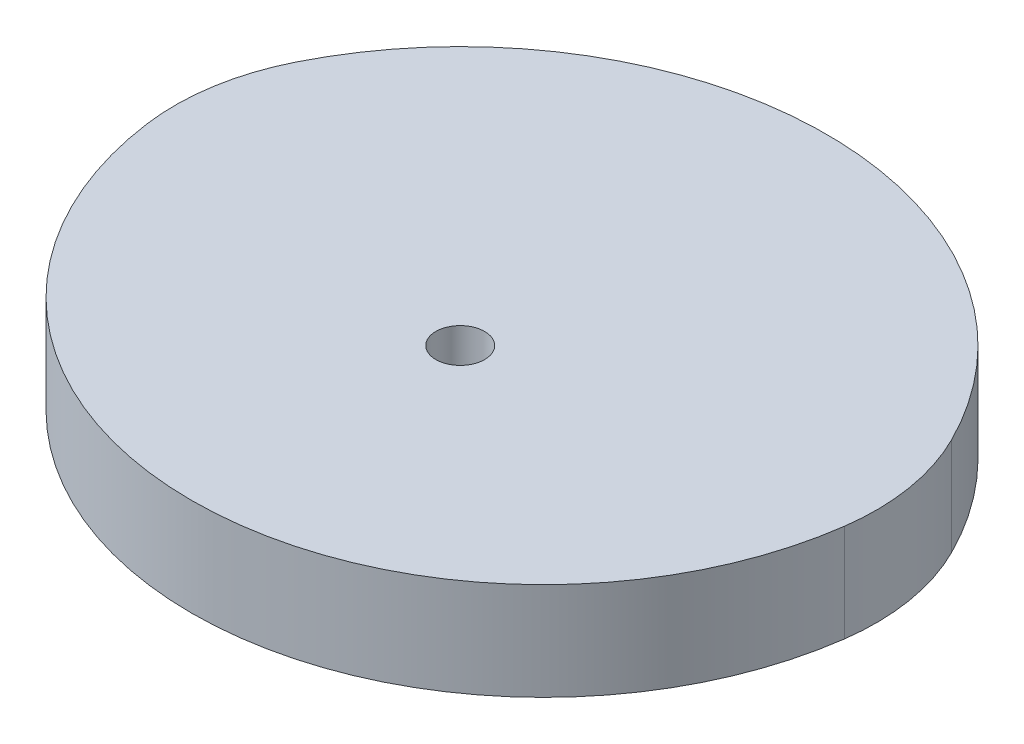
ISO-10303-21;
HEADER;
FILE_DESCRIPTION(('STEP AP214'),'2;1');
FILE_NAME('part.step','',(''),(''),'','','');
FILE_SCHEMA(('AUTOMOTIVE_DESIGN { 1 0 10303 214 1 1 1 1 }'));
ENDSEC;
DATA;
#1=APPLICATION_CONTEXT('core data for automotive mechanical design processes');
#2=APPLICATION_PROTOCOL_DEFINITION('international standard','automotive_design',2000,#1);
#3=PRODUCT_CONTEXT('',#1,'mechanical');
#4=PRODUCT('Part','Part','',(#3));
#5=PRODUCT_RELATED_PRODUCT_CATEGORY('part','',(#4));
#6=PRODUCT_DEFINITION_FORMATION('','',#4);
#7=PRODUCT_DEFINITION_CONTEXT('part definition',#1,'design');
#8=PRODUCT_DEFINITION('design','',#6,#7);
#9=PRODUCT_DEFINITION_SHAPE('','',#8);
#10=(LENGTH_UNIT() NAMED_UNIT(*) SI_UNIT(.MILLI.,.METRE.));
#11=(NAMED_UNIT(*) PLANE_ANGLE_UNIT() SI_UNIT($,.RADIAN.));
#12=(NAMED_UNIT(*) SI_UNIT($,.STERADIAN.) SOLID_ANGLE_UNIT());
#13=UNCERTAINTY_MEASURE_WITH_UNIT(LENGTH_MEASURE(1.E-05),#10,'distance_accuracy_value','');
#14=(GEOMETRIC_REPRESENTATION_CONTEXT(3) GLOBAL_UNCERTAINTY_ASSIGNED_CONTEXT((#13)) GLOBAL_UNIT_ASSIGNED_CONTEXT((#10,
#11,#12)) REPRESENTATION_CONTEXT('',''));
#15=CARTESIAN_POINT('',(0.,0.,0.));
#16=DIRECTION('',(0.,0.,1.));
#17=DIRECTION('',(1.,0.,0.));
#18=AXIS2_PLACEMENT_3D('',#15,#16,#17);
#19=CARTESIAN_POINT('',(0.,0.,0.));
#20=DIRECTION('',(0.,1.,0.));
#21=DIRECTION('',(0.,0.,1.));
#22=AXIS2_PLACEMENT_3D('',#19,#20,#21);
#23=PLANE('',#22);
#24=CARTESIAN_POINT('',(0.,0.,0.));
#25=DIRECTION('',(0.,1.,0.));
#26=DIRECTION('',(0.,0.,1.));
#27=AXIS2_PLACEMENT_3D('',#24,#25,#26);
#28=CIRCLE('',#27,5.);
#29=CARTESIAN_POINT('',(0.,0.,5.));
#30=VERTEX_POINT('',#29);
#31=EDGE_CURVE('E200',#30,#30,#28,.T.);
#32=ORIENTED_EDGE('',*,*,#31,.T.);
#33=EDGE_LOOP('',(#32));
#34=FACE_BOUND('',#33,.T.);
#35=CARTESIAN_POINT('',(-26.8328157299973,0.,-13.416407864999));
#36=DIRECTION('',(0.,1.,0.));
#37=DIRECTION('',(0.,0.,1.));
#38=AXIS2_PLACEMENT_3D('',#35,#36,#37);
#39=CIRCLE('',#38,20.0000000000002);
#40=CARTESIAN_POINT('',(-44.7213595499957,0.,-22.3606797749985));
#41=VERTEX_POINT('',#40);
#42=CARTESIAN_POINT('',(-46.6487648968934,0.,-10.7093506777572));
#43=VERTEX_POINT('',#42);
#44=EDGE_CURVE('E182',#41,#43,#39,.T.);
#45=ORIENTED_EDGE('',*,*,#44,.F.);
#46=CARTESIAN_POINT('',(0.,0.,0.));
#47=DIRECTION('',(0.,1.,0.));
#48=DIRECTION('',(0.,0.,1.));
#49=AXIS2_PLACEMENT_3D('',#46,#47,#48);
#50=CIRCLE('',#49,50.0000000000003);
#51=CARTESIAN_POINT('',(44.7213595499957,0.,-22.3606797749988));
#52=VERTEX_POINT('',#51);
#53=EDGE_CURVE('E60',#52,#41,#50,.T.);
#54=ORIENTED_EDGE('',*,*,#53,.F.);
#55=CARTESIAN_POINT('',(26.8328157299979,0.,-13.4164078649994));
#56=DIRECTION('',(0.,1.,0.));
#57=DIRECTION('',(0.,0.,1.));
#58=AXIS2_PLACEMENT_3D('',#55,#56,#57);
#59=CIRCLE('',#58,19.9999999999997);
#60=CARTESIAN_POINT('',(46.6487648968934,0.,-10.7093506777578));
#61=VERTEX_POINT('',#60);
#62=EDGE_CURVE('E139',#52,#61,#59,.F.);
#63=ORIENTED_EDGE('',*,*,#62,.T.);
#64=CARTESIAN_POINT('',(0.,0.,-17.0820393249935));
#65=DIRECTION('',(0.,1.,0.));
#66=DIRECTION('',(0.,0.,1.));
#67=AXIS2_PLACEMENT_3D('',#64,#65,#66);
#68=CIRCLE('',#67,47.0820393249936);
#69=EDGE_CURVE('E179',#43,#61,#68,.T.);
#70=ORIENTED_EDGE('',*,*,#69,.F.);
#71=EDGE_LOOP('',(#45,#54,#63,#70));
#72=FACE_BOUND('',#71,.T.);
#73=ADVANCED_FACE('F45',(#34,#72),#23,.F.);
#74=CARTESIAN_POINT('',(26.8328157299976,0.,-13.4164078649992));
#75=DIRECTION('',(0.,1.,0.));
#76=DIRECTION('',(0.,0.,1.));
#77=AXIS2_PLACEMENT_3D('',#74,#75,#76);
#78=CIRCLE('',#77,45.);
#79=CARTESIAN_POINT('',(67.0820393249936,0.,-33.5410196624978));
#80=VERTEX_POINT('',#79);
#81=CARTESIAN_POINT('',(71.4187013555134,0.,-7.32552919370548));
#82=VERTEX_POINT('',#81);
#83=EDGE_CURVE('E223',#80,#82,#78,.F.);
#84=ORIENTED_EDGE('',*,*,#83,.T.);
#85=CARTESIAN_POINT('',(0.,0.,-17.0820393249935));
#86=DIRECTION('',(0.,1.,0.));
#87=DIRECTION('',(0.,0.,1.));
#88=AXIS2_PLACEMENT_3D('',#85,#86,#87);
#89=CIRCLE('',#88,72.0820393249937);
#90=CARTESIAN_POINT('',(-71.4187013555134,0.,-7.3255291937055));
#91=VERTEX_POINT('',#90);
#92=EDGE_CURVE('E209',#91,#82,#89,.T.);
#93=ORIENTED_EDGE('',*,*,#92,.F.);
#94=CARTESIAN_POINT('',(-26.8328157299976,0.,-13.4164078649992));
#95=DIRECTION('',(0.,1.,0.));
#96=DIRECTION('',(0.,0.,1.));
#97=AXIS2_PLACEMENT_3D('',#94,#95,#96);
#98=CIRCLE('',#97,45.);
#99=CARTESIAN_POINT('',(-67.0820393249936,0.,-33.5410196624978));
#100=VERTEX_POINT('',#99);
#101=EDGE_CURVE('E229',#100,#91,#98,.T.);
#102=ORIENTED_EDGE('',*,*,#101,.F.);
#103=CARTESIAN_POINT('',(0.,0.,0.));
#104=DIRECTION('',(0.,1.,0.));
#105=DIRECTION('',(0.,0.,1.));
#106=AXIS2_PLACEMENT_3D('',#103,#104,#105);
#107=CIRCLE('',#106,75.0000000000003);
#108=EDGE_CURVE('E226',#80,#100,#107,.T.);
#109=ORIENTED_EDGE('',*,*,#108,.F.);
#110=EDGE_LOOP('',(#84,#93,#102,#109));
#111=FACE_BOUND('',#110,.T.);
#112=CARTESIAN_POINT('',(0.,0.,-17.0820393249935));
#113=DIRECTION('',(0.,1.,0.));
#114=DIRECTION('',(0.,0.,1.));
#115=AXIS2_PLACEMENT_3D('',#112,#113,#114);
#116=CIRCLE('',#115,67.0820393249936);
#117=CARTESIAN_POINT('',(-66.4647140637893,0.,-8.00229349051539));
#118=VERTEX_POINT('',#117);
#119=CARTESIAN_POINT('',(66.4647140637894,0.,-8.00229349051627));
#120=VERTEX_POINT('',#119);
#121=EDGE_CURVE('E157',#118,#120,#116,.T.);
#122=ORIENTED_EDGE('',*,*,#121,.T.);
#123=CARTESIAN_POINT('',(26.8328157299979,0.,-13.4164078649994));
#124=DIRECTION('',(0.,1.,0.));
#125=DIRECTION('',(0.,0.,1.));
#126=AXIS2_PLACEMENT_3D('',#123,#124,#125);
#127=CIRCLE('',#126,39.9999999999997);
#128=CARTESIAN_POINT('',(62.6099033699938,0.,-31.3049516849983));
#129=VERTEX_POINT('',#128);
#130=EDGE_CURVE('E68',#129,#120,#127,.F.);
#131=ORIENTED_EDGE('',*,*,#130,.F.);
#132=CARTESIAN_POINT('',(0.,0.,0.));
#133=DIRECTION('',(0.,1.,0.));
#134=DIRECTION('',(0.,0.,1.));
#135=AXIS2_PLACEMENT_3D('',#132,#133,#134);
#136=CIRCLE('',#135,70.0000000000003);
#137=CARTESIAN_POINT('',(-62.609903369994,0.,-31.3049516849979));
#138=VERTEX_POINT('',#137);
#139=EDGE_CURVE('E186',#129,#138,#136,.T.);
#140=ORIENTED_EDGE('',*,*,#139,.T.);
#141=CARTESIAN_POINT('',(-26.8328157299973,0.,-13.416407864999));
#142=DIRECTION('',(0.,1.,0.));
#143=DIRECTION('',(0.,0.,1.));
#144=AXIS2_PLACEMENT_3D('',#141,#142,#143);
#145=CIRCLE('',#144,40.0000000000002);
#146=EDGE_CURVE('E160',#138,#118,#145,.T.);
#147=ORIENTED_EDGE('',*,*,#146,.T.);
#148=EDGE_LOOP('',(#122,#131,#140,#147));
#149=FACE_BOUND('',#148,.T.);
#150=ADVANCED_FACE('F248',(#111,#149),#23,.F.);
#151=CARTESIAN_POINT('',(26.8328157299976,20.,-13.4164078649992));
#152=DIRECTION('',(0.,-1.,0.));
#153=DIRECTION('',(0.,0.,-1.));
#154=AXIS2_PLACEMENT_3D('',#151,#152,#153);
#155=CYLINDRICAL_SURFACE('',#154,45.);
#156=ORIENTED_EDGE('',*,*,#83,.F.);
#157=DIRECTION('',(0.,-1.,0.));
#158=VECTOR('',#157,1.);
#159=CARTESIAN_POINT('',(67.0820393249936,20.,-33.5410196624978));
#160=LINE('',#159,#158);
#161=CARTESIAN_POINT('',(67.0820393249936,20.,-33.5410196624978));
#162=VERTEX_POINT('',#161);
#163=EDGE_CURVE('E11',#162,#80,#160,.T.);
#164=ORIENTED_EDGE('',*,*,#163,.F.);
#165=CARTESIAN_POINT('',(26.8328157299976,20.,-13.4164078649992));
#166=DIRECTION('',(0.,1.,0.));
#167=DIRECTION('',(0.,0.,1.));
#168=AXIS2_PLACEMENT_3D('',#165,#166,#167);
#169=CIRCLE('',#168,45.);
#170=CARTESIAN_POINT('',(71.4187013555134,20.,-7.32552919370548));
#171=VERTEX_POINT('',#170);
#172=EDGE_CURVE('E208',#162,#171,#169,.F.);
#173=ORIENTED_EDGE('',*,*,#172,.T.);
#174=DIRECTION('',(0.,-1.,0.));
#175=VECTOR('',#174,1.);
#176=CARTESIAN_POINT('',(71.4187013555134,20.,-7.32552919370548));
#177=LINE('',#176,#175);
#178=EDGE_CURVE('E220',#171,#82,#177,.T.);
#179=ORIENTED_EDGE('',*,*,#178,.T.);
#180=EDGE_LOOP('',(#156,#164,#173,#179));
#181=FACE_BOUND('',#180,.T.);
#182=ADVANCED_FACE('F251',(#181),#155,.T.);
#183=CARTESIAN_POINT('',(0.,20.,0.));
#184=DIRECTION('',(0.,-1.,0.));
#185=DIRECTION('',(0.,0.,-1.));
#186=AXIS2_PLACEMENT_3D('',#183,#184,#185);
#187=CYLINDRICAL_SURFACE('',#186,75.0000000000003);
#188=ORIENTED_EDGE('',*,*,#108,.T.);
#189=DIRECTION('',(0.,-1.,0.));
#190=VECTOR('',#189,1.);
#191=CARTESIAN_POINT('',(-67.0820393249936,20.,-33.5410196624978));
#192=LINE('',#191,#190);
#193=CARTESIAN_POINT('',(-67.0820393249936,20.,-33.5410196624978));
#194=VERTEX_POINT('',#193);
#195=EDGE_CURVE('E53',#194,#100,#192,.T.);
#196=ORIENTED_EDGE('',*,*,#195,.F.);
#197=CARTESIAN_POINT('',(0.,20.,0.));
#198=DIRECTION('',(0.,1.,0.));
#199=DIRECTION('',(0.,0.,1.));
#200=AXIS2_PLACEMENT_3D('',#197,#198,#199);
#201=CIRCLE('',#200,75.0000000000003);
#202=EDGE_CURVE('E212',#162,#194,#201,.T.);
#203=ORIENTED_EDGE('',*,*,#202,.F.);
#204=ORIENTED_EDGE('',*,*,#163,.T.);
#205=EDGE_LOOP('',(#188,#196,#203,#204));
#206=FACE_BOUND('',#205,.T.);
#207=ADVANCED_FACE('F245',(#206),#187,.T.);
#208=CARTESIAN_POINT('',(-26.8328157299976,20.,-13.4164078649992));
#209=DIRECTION('',(0.,-1.,0.));
#210=DIRECTION('',(0.,0.,-1.));
#211=AXIS2_PLACEMENT_3D('',#208,#209,#210);
#212=CYLINDRICAL_SURFACE('',#211,45.);
#213=ORIENTED_EDGE('',*,*,#101,.T.);
#214=DIRECTION('',(0.,-1.,0.));
#215=VECTOR('',#214,1.);
#216=CARTESIAN_POINT('',(-71.4187013555134,20.,-7.3255291937055));
#217=LINE('',#216,#215);
#218=CARTESIAN_POINT('',(-71.4187013555134,20.,-7.3255291937055));
#219=VERTEX_POINT('',#218);
#220=EDGE_CURVE('E235',#219,#91,#217,.T.);
#221=ORIENTED_EDGE('',*,*,#220,.F.);
#222=CARTESIAN_POINT('',(-26.8328157299976,20.,-13.4164078649992));
#223=DIRECTION('',(0.,1.,0.));
#224=DIRECTION('',(0.,0.,1.));
#225=AXIS2_PLACEMENT_3D('',#222,#223,#224);
#226=CIRCLE('',#225,45.);
#227=EDGE_CURVE('E215',#194,#219,#226,.T.);
#228=ORIENTED_EDGE('',*,*,#227,.F.);
#229=ORIENTED_EDGE('',*,*,#195,.T.);
#230=EDGE_LOOP('',(#213,#221,#228,#229));
#231=FACE_BOUND('',#230,.T.);
#232=ADVANCED_FACE('F240',(#231),#212,.T.);
#233=CARTESIAN_POINT('',(0.,20.,0.));
#234=DIRECTION('',(0.,-1.,0.));
#235=DIRECTION('',(0.,0.,-1.));
#236=AXIS2_PLACEMENT_3D('',#233,#234,#235);
#237=CYLINDRICAL_SURFACE('',#236,5.);
#238=CARTESIAN_POINT('',(0.,20.,0.));
#239=DIRECTION('',(0.,1.,0.));
#240=DIRECTION('',(0.,0.,1.));
#241=AXIS2_PLACEMENT_3D('',#238,#239,#240);
#242=CIRCLE('',#241,5.);
#243=CARTESIAN_POINT('',(0.,20.,5.));
#244=VERTEX_POINT('',#243);
#245=EDGE_CURVE('E205',#244,#244,#242,.T.);
#246=ORIENTED_EDGE('',*,*,#245,.T.);
#247=EDGE_LOOP('',(#246));
#248=FACE_BOUND('',#247,.T.);
#249=ORIENTED_EDGE('',*,*,#31,.F.);
#250=EDGE_LOOP('',(#249));
#251=FACE_BOUND('',#250,.T.);
#252=ADVANCED_FACE('F47',(#248,#251),#237,.F.);
#253=CARTESIAN_POINT('',(0.,20.,-17.0820393249935));
#254=DIRECTION('',(0.,-1.,0.));
#255=DIRECTION('',(0.,0.,-1.));
#256=AXIS2_PLACEMENT_3D('',#253,#254,#255);
#257=CYLINDRICAL_SURFACE('',#256,72.0820393249937);
#258=ORIENTED_EDGE('',*,*,#92,.T.);
#259=ORIENTED_EDGE('',*,*,#178,.F.);
#260=CARTESIAN_POINT('',(0.,20.,-17.0820393249935));
#261=DIRECTION('',(0.,1.,0.));
#262=DIRECTION('',(0.,0.,1.));
#263=AXIS2_PLACEMENT_3D('',#260,#261,#262);
#264=CIRCLE('',#263,72.0820393249937);
#265=EDGE_CURVE('E218',#219,#171,#264,.T.);
#266=ORIENTED_EDGE('',*,*,#265,.F.);
#267=ORIENTED_EDGE('',*,*,#220,.T.);
#268=EDGE_LOOP('',(#258,#259,#266,#267));
#269=FACE_BOUND('',#268,.T.);
#270=ADVANCED_FACE('F255',(#269),#257,.T.);
#271=CARTESIAN_POINT('',(0.,20.,0.));
#272=DIRECTION('',(0.,1.,0.));
#273=DIRECTION('',(0.,0.,1.));
#274=AXIS2_PLACEMENT_3D('',#271,#272,#273);
#275=PLANE('',#274);
#276=ORIENTED_EDGE('',*,*,#245,.F.);
#277=EDGE_LOOP('',(#276));
#278=FACE_BOUND('',#277,.T.);
#279=ORIENTED_EDGE('',*,*,#172,.F.);
#280=ORIENTED_EDGE('',*,*,#202,.T.);
#281=ORIENTED_EDGE('',*,*,#227,.T.);
#282=ORIENTED_EDGE('',*,*,#265,.T.);
#283=EDGE_LOOP('',(#279,#280,#281,#282));
#284=FACE_BOUND('',#283,.T.);
#285=ADVANCED_FACE('F257',(#278,#284),#275,.T.);
#286=CARTESIAN_POINT('',(26.8328157299979,10.,-13.4164078649994));
#287=DIRECTION('',(0.,-1.,0.));
#288=DIRECTION('',(0.,0.,-1.));
#289=AXIS2_PLACEMENT_3D('',#286,#287,#288);
#290=CYLINDRICAL_SURFACE('',#289,39.9999999999997);
#291=ORIENTED_EDGE('',*,*,#130,.T.);
#292=DIRECTION('',(0.,-1.,0.));
#293=VECTOR('',#292,1.);
#294=CARTESIAN_POINT('',(66.4647140637894,10.,-8.00229349051627));
#295=LINE('',#294,#293);
#296=CARTESIAN_POINT('',(66.4647140637894,10.,-8.00229349051627));
#297=VERTEX_POINT('',#296);
#298=EDGE_CURVE('E141',#297,#120,#295,.T.);
#299=ORIENTED_EDGE('',*,*,#298,.F.);
#300=CARTESIAN_POINT('',(26.8328157299979,10.,-13.4164078649994));
#301=DIRECTION('',(0.,1.,0.));
#302=DIRECTION('',(0.,0.,1.));
#303=AXIS2_PLACEMENT_3D('',#300,#301,#302);
#304=CIRCLE('',#303,39.9999999999997);
#305=CARTESIAN_POINT('',(62.6099033699938,10.,-31.3049516849983));
#306=VERTEX_POINT('',#305);
#307=EDGE_CURVE('E166',#306,#297,#304,.F.);
#308=ORIENTED_EDGE('',*,*,#307,.F.);
#309=DIRECTION('',(0.,-1.,0.));
#310=VECTOR('',#309,1.);
#311=CARTESIAN_POINT('',(62.6099033699938,10.,-31.3049516849983));
#312=LINE('',#311,#310);
#313=EDGE_CURVE('E198',#306,#129,#312,.T.);
#314=ORIENTED_EDGE('',*,*,#313,.T.);
#315=EDGE_LOOP('',(#291,#299,#308,#314));
#316=FACE_BOUND('',#315,.T.);
#317=ADVANCED_FACE('F259',(#316),#290,.F.);
#318=CARTESIAN_POINT('',(0.,10.,0.));
#319=DIRECTION('',(0.,-1.,0.));
#320=DIRECTION('',(0.,0.,-1.));
#321=AXIS2_PLACEMENT_3D('',#318,#319,#320);
#322=CYLINDRICAL_SURFACE('',#321,70.0000000000003);
#323=ORIENTED_EDGE('',*,*,#139,.F.);
#324=ORIENTED_EDGE('',*,*,#313,.F.);
#325=CARTESIAN_POINT('',(0.,10.,0.));
#326=DIRECTION('',(0.,1.,0.));
#327=DIRECTION('',(0.,0.,1.));
#328=AXIS2_PLACEMENT_3D('',#325,#326,#327);
#329=CIRCLE('',#328,70.0000000000003);
#330=CARTESIAN_POINT('',(-62.609903369994,10.,-31.3049516849979));
#331=VERTEX_POINT('',#330);
#332=EDGE_CURVE('E169',#306,#331,#329,.T.);
#333=ORIENTED_EDGE('',*,*,#332,.T.);
#334=DIRECTION('',(0.,-1.,0.));
#335=VECTOR('',#334,1.);
#336=CARTESIAN_POINT('',(-62.609903369994,10.,-31.3049516849979));
#337=LINE('',#336,#335);
#338=EDGE_CURVE('E195',#331,#138,#337,.T.);
#339=ORIENTED_EDGE('',*,*,#338,.T.);
#340=EDGE_LOOP('',(#323,#324,#333,#339));
#341=FACE_BOUND('',#340,.T.);
#342=ADVANCED_FACE('F267',(#341),#322,.F.);
#343=CARTESIAN_POINT('',(-26.8328157299973,10.,-13.416407864999));
#344=DIRECTION('',(0.,-1.,0.));
#345=DIRECTION('',(0.,0.,-1.));
#346=AXIS2_PLACEMENT_3D('',#343,#344,#345);
#347=CYLINDRICAL_SURFACE('',#346,40.0000000000002);
#348=ORIENTED_EDGE('',*,*,#146,.F.);
#349=ORIENTED_EDGE('',*,*,#338,.F.);
#350=CARTESIAN_POINT('',(-26.8328157299973,10.,-13.416407864999));
#351=DIRECTION('',(0.,1.,0.));
#352=DIRECTION('',(0.,0.,1.));
#353=AXIS2_PLACEMENT_3D('',#350,#351,#352);
#354=CIRCLE('',#353,40.0000000000002);
#355=CARTESIAN_POINT('',(-66.4647140637893,10.,-8.00229349051539));
#356=VERTEX_POINT('',#355);
#357=EDGE_CURVE('E172',#331,#356,#354,.T.);
#358=ORIENTED_EDGE('',*,*,#357,.T.);
#359=DIRECTION('',(0.,-1.,0.));
#360=VECTOR('',#359,1.);
#361=CARTESIAN_POINT('',(-66.4647140637893,10.,-8.00229349051539));
#362=LINE('',#361,#360);
#363=EDGE_CURVE('E192',#356,#118,#362,.T.);
#364=ORIENTED_EDGE('',*,*,#363,.T.);
#365=EDGE_LOOP('',(#348,#349,#358,#364));
#366=FACE_BOUND('',#365,.T.);
#367=ADVANCED_FACE('F357',(#366),#347,.F.);
#368=CARTESIAN_POINT('',(0.,10.,0.));
#369=DIRECTION('',(0.,-1.,0.));
#370=DIRECTION('',(0.,0.,-1.));
#371=AXIS2_PLACEMENT_3D('',#368,#369,#370);
#372=CYLINDRICAL_SURFACE('',#371,50.0000000000003);
#373=ORIENTED_EDGE('',*,*,#53,.T.);
#374=DIRECTION('',(0.,-1.,0.));
#375=VECTOR('',#374,1.);
#376=CARTESIAN_POINT('',(-44.7213595499958,10.,-22.3606797749986));
#377=LINE('',#376,#375);
#378=CARTESIAN_POINT('',(-44.7213595499958,10.,-22.3606797749986));
#379=VERTEX_POINT('',#378);
#380=EDGE_CURVE('E156',#379,#41,#377,.T.);
#381=ORIENTED_EDGE('',*,*,#380,.F.);
#382=CARTESIAN_POINT('',(0.,10.,0.));
#383=DIRECTION('',(0.,1.,0.));
#384=DIRECTION('',(0.,0.,1.));
#385=AXIS2_PLACEMENT_3D('',#382,#383,#384);
#386=CIRCLE('',#385,50.0000000000003);
#387=CARTESIAN_POINT('',(44.7213595499957,10.,-22.3606797749988));
#388=VERTEX_POINT('',#387);
#389=EDGE_CURVE('E150',#388,#379,#386,.T.);
#390=ORIENTED_EDGE('',*,*,#389,.F.);
#391=DIRECTION('',(0.,-1.,0.));
#392=VECTOR('',#391,1.);
#393=CARTESIAN_POINT('',(44.7213595499957,10.,-22.3606797749988));
#394=LINE('',#393,#392);
#395=EDGE_CURVE('E133',#388,#52,#394,.T.);
#396=ORIENTED_EDGE('',*,*,#395,.T.);
#397=EDGE_LOOP('',(#373,#381,#390,#396));
#398=FACE_BOUND('',#397,.T.);
#399=ADVANCED_FACE('F155',(#398),#372,.T.);
#400=CARTESIAN_POINT('',(26.8328157299979,10.,-13.4164078649994));
#401=DIRECTION('',(0.,-1.,0.));
#402=DIRECTION('',(0.,0.,-1.));
#403=AXIS2_PLACEMENT_3D('',#400,#401,#402);
#404=CYLINDRICAL_SURFACE('',#403,19.9999999999997);
#405=ORIENTED_EDGE('',*,*,#62,.F.);
#406=ORIENTED_EDGE('',*,*,#395,.F.);
#407=CARTESIAN_POINT('',(26.8328157299979,10.,-13.4164078649994));
#408=DIRECTION('',(0.,1.,0.));
#409=DIRECTION('',(0.,0.,1.));
#410=AXIS2_PLACEMENT_3D('',#407,#408,#409);
#411=CIRCLE('',#410,19.9999999999997);
#412=CARTESIAN_POINT('',(46.6487648968934,10.,-10.7093506777578));
#413=VERTEX_POINT('',#412);
#414=EDGE_CURVE('E136',#388,#413,#411,.F.);
#415=ORIENTED_EDGE('',*,*,#414,.T.);
#416=DIRECTION('',(0.,-1.,0.));
#417=VECTOR('',#416,1.);
#418=CARTESIAN_POINT('',(46.6487648968934,10.,-10.7093506777578));
#419=LINE('',#418,#417);
#420=EDGE_CURVE('E142',#413,#61,#419,.T.);
#421=ORIENTED_EDGE('',*,*,#420,.T.);
#422=EDGE_LOOP('',(#405,#406,#415,#421));
#423=FACE_BOUND('',#422,.T.);
#424=ADVANCED_FACE('F135',(#423),#404,.T.);
#425=CARTESIAN_POINT('',(0.,10.,-17.0820393249935));
#426=DIRECTION('',(0.,-1.,0.));
#427=DIRECTION('',(0.,0.,-1.));
#428=AXIS2_PLACEMENT_3D('',#425,#426,#427);
#429=CYLINDRICAL_SURFACE('',#428,47.0820393249936);
#430=ORIENTED_EDGE('',*,*,#69,.T.);
#431=ORIENTED_EDGE('',*,*,#420,.F.);
#432=CARTESIAN_POINT('',(0.,10.,-17.0820393249935));
#433=DIRECTION('',(0.,1.,0.));
#434=DIRECTION('',(0.,0.,1.));
#435=AXIS2_PLACEMENT_3D('',#432,#433,#434);
#436=CIRCLE('',#435,47.0820393249936);
#437=CARTESIAN_POINT('',(-46.6487648968934,10.,-10.7093506777572));
#438=VERTEX_POINT('',#437);
#439=EDGE_CURVE('E153',#438,#413,#436,.T.);
#440=ORIENTED_EDGE('',*,*,#439,.F.);
#441=DIRECTION('',(0.,-1.,0.));
#442=VECTOR('',#441,1.);
#443=CARTESIAN_POINT('',(-46.6487648968934,10.,-10.7093506777572));
#444=LINE('',#443,#442);
#445=EDGE_CURVE('E202',#438,#43,#444,.T.);
#446=ORIENTED_EDGE('',*,*,#445,.T.);
#447=EDGE_LOOP('',(#430,#431,#440,#446));
#448=FACE_BOUND('',#447,.T.);
#449=ADVANCED_FACE('F383',(#448),#429,.T.);
#450=CARTESIAN_POINT('',(-26.8328157299973,10.,-13.416407864999));
#451=DIRECTION('',(0.,-1.,0.));
#452=DIRECTION('',(0.,0.,-1.));
#453=AXIS2_PLACEMENT_3D('',#450,#451,#452);
#454=CYLINDRICAL_SURFACE('',#453,20.0000000000002);
#455=ORIENTED_EDGE('',*,*,#44,.T.);
#456=ORIENTED_EDGE('',*,*,#445,.F.);
#457=CARTESIAN_POINT('',(-26.8328157299973,10.,-13.416407864999));
#458=DIRECTION('',(0.,1.,0.));
#459=DIRECTION('',(0.,0.,1.));
#460=AXIS2_PLACEMENT_3D('',#457,#458,#459);
#461=CIRCLE('',#460,20.0000000000002);
#462=EDGE_CURVE('E164',#379,#438,#461,.T.);
#463=ORIENTED_EDGE('',*,*,#462,.F.);
#464=ORIENTED_EDGE('',*,*,#380,.T.);
#465=EDGE_LOOP('',(#455,#456,#463,#464));
#466=FACE_BOUND('',#465,.T.);
#467=ADVANCED_FACE('F392',(#466),#454,.T.);
#468=CARTESIAN_POINT('',(0.,10.,-17.0820393249935));
#469=DIRECTION('',(0.,-1.,0.));
#470=DIRECTION('',(0.,0.,-1.));
#471=AXIS2_PLACEMENT_3D('',#468,#469,#470);
#472=CYLINDRICAL_SURFACE('',#471,67.0820393249936);
#473=ORIENTED_EDGE('',*,*,#121,.F.);
#474=ORIENTED_EDGE('',*,*,#363,.F.);
#475=CARTESIAN_POINT('',(0.,10.,-17.0820393249935));
#476=DIRECTION('',(0.,1.,0.));
#477=DIRECTION('',(0.,0.,1.));
#478=AXIS2_PLACEMENT_3D('',#475,#476,#477);
#479=CIRCLE('',#478,67.0820393249936);
#480=EDGE_CURVE('E175',#356,#297,#479,.T.);
#481=ORIENTED_EDGE('',*,*,#480,.T.);
#482=ORIENTED_EDGE('',*,*,#298,.T.);
#483=EDGE_LOOP('',(#473,#474,#481,#482));
#484=FACE_BOUND('',#483,.T.);
#485=ADVANCED_FACE('F402',(#484),#472,.F.);
#486=CARTESIAN_POINT('',(0.,10.,0.));
#487=DIRECTION('',(0.,1.,0.));
#488=DIRECTION('',(0.,0.,1.));
#489=AXIS2_PLACEMENT_3D('',#486,#487,#488);
#490=PLANE('',#489);
#491=ORIENTED_EDGE('',*,*,#389,.T.);
#492=ORIENTED_EDGE('',*,*,#462,.T.);
#493=ORIENTED_EDGE('',*,*,#439,.T.);
#494=ORIENTED_EDGE('',*,*,#414,.F.);
#495=EDGE_LOOP('',(#491,#492,#493,#494));
#496=FACE_BOUND('',#495,.T.);
#497=ORIENTED_EDGE('',*,*,#307,.T.);
#498=ORIENTED_EDGE('',*,*,#480,.F.);
#499=ORIENTED_EDGE('',*,*,#357,.F.);
#500=ORIENTED_EDGE('',*,*,#332,.F.);
#501=EDGE_LOOP('',(#497,#498,#499,#500));
#502=FACE_BOUND('',#501,.T.);
#503=ADVANCED_FACE('F147',(#496,#502),#490,.F.);
#504=CLOSED_SHELL('',(#73,#150,#182,#207,#232,#252,#270,#285,#317,#342,#367,#399,#424,#449,#467,
#485,#503));
#505=MANIFOLD_SOLID_BREP('B2',#504);
#506=ADVANCED_BREP_SHAPE_REPRESENTATION('',(#18,#505),#14);
#507=SHAPE_DEFINITION_REPRESENTATION(#9,#506);
ENDSEC;
END-ISO-10303-21;
